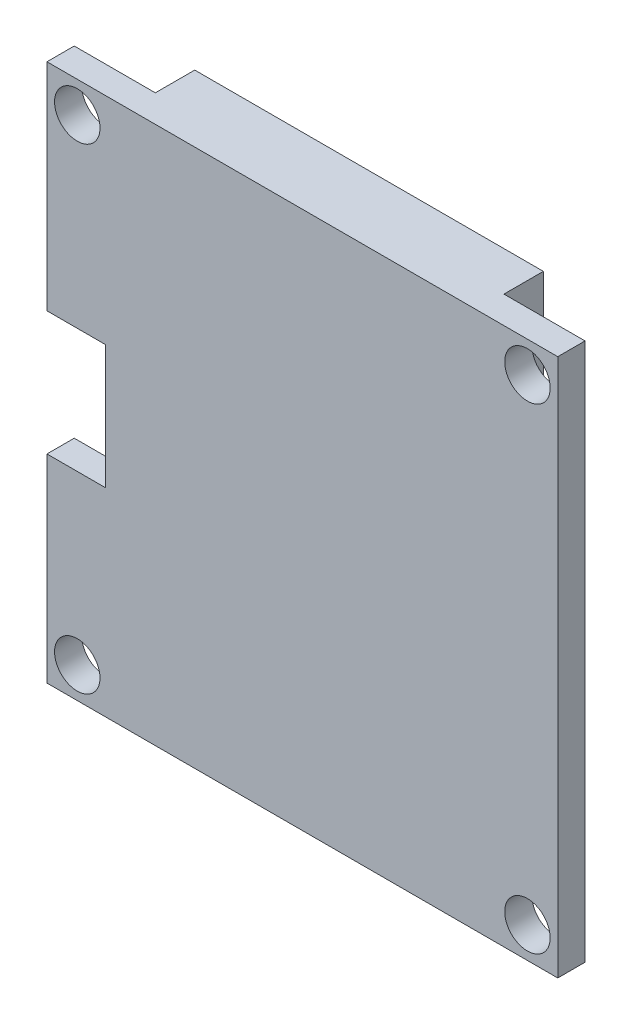
ISO-10303-21;
HEADER;
FILE_DESCRIPTION(('STEP AP214'),'2;1');
FILE_NAME('part.step','',(''),(''),'','','');
FILE_SCHEMA(('AUTOMOTIVE_DESIGN { 1 0 10303 214 1 1 1 1 }'));
ENDSEC;
DATA;
#1=APPLICATION_CONTEXT('core data for automotive mechanical design processes');
#2=APPLICATION_PROTOCOL_DEFINITION('international standard','automotive_design',2000,#1);
#3=PRODUCT_CONTEXT('',#1,'mechanical');
#4=PRODUCT('Part','Part','',(#3));
#5=PRODUCT_RELATED_PRODUCT_CATEGORY('part','',(#4));
#6=PRODUCT_DEFINITION_FORMATION('','',#4);
#7=PRODUCT_DEFINITION_CONTEXT('part definition',#1,'design');
#8=PRODUCT_DEFINITION('design','',#6,#7);
#9=PRODUCT_DEFINITION_SHAPE('','',#8);
#10=(LENGTH_UNIT() NAMED_UNIT(*) SI_UNIT(.MILLI.,.METRE.));
#11=(NAMED_UNIT(*) PLANE_ANGLE_UNIT() SI_UNIT($,.RADIAN.));
#12=(NAMED_UNIT(*) SI_UNIT($,.STERADIAN.) SOLID_ANGLE_UNIT());
#13=UNCERTAINTY_MEASURE_WITH_UNIT(LENGTH_MEASURE(1.E-05),#10,'distance_accuracy_value','');
#14=(GEOMETRIC_REPRESENTATION_CONTEXT(3) GLOBAL_UNCERTAINTY_ASSIGNED_CONTEXT((#13)) GLOBAL_UNIT_ASSIGNED_CONTEXT((#10,
#11,#12)) REPRESENTATION_CONTEXT('',''));
#15=CARTESIAN_POINT('',(0.,0.,0.));
#16=DIRECTION('',(0.,0.,1.));
#17=DIRECTION('',(1.,0.,0.));
#18=AXIS2_PLACEMENT_3D('',#15,#16,#17);
#19=CARTESIAN_POINT('',(0.,0.,0.));
#20=DIRECTION('',(0.,0.,1.));
#21=DIRECTION('',(1.,0.,0.));
#22=AXIS2_PLACEMENT_3D('',#19,#20,#21);
#23=PLANE('',#22);
#24=CARTESIAN_POINT('',(14.6772720874822,5.7173016922718,0.));
#25=DIRECTION('',(0.,0.,-1.));
#26=DIRECTION('',(-1.,0.,0.));
#27=AXIS2_PLACEMENT_3D('',#24,#25,#26);
#28=CIRCLE('',#27,0.520017215137613);
#29=CARTESIAN_POINT('',(14.1572548723445,5.7173016922718,0.));
#30=VERTEX_POINT('',#29);
#31=EDGE_CURVE('E287',#30,#30,#28,.T.);
#32=ORIENTED_EDGE('',*,*,#31,.F.);
#33=EDGE_LOOP('',(#32));
#34=FACE_BOUND('',#33,.T.);
#35=CARTESIAN_POINT('',(14.7220971332871,-5.61078136269089,0.));
#36=DIRECTION('',(0.,0.,-1.));
#37=DIRECTION('',(-1.,0.,0.));
#38=AXIS2_PLACEMENT_3D('',#35,#36,#37);
#39=CIRCLE('',#38,0.510447255882217);
#40=CARTESIAN_POINT('',(14.2116498774049,-5.61078136269089,0.));
#41=VERTEX_POINT('',#40);
#42=EDGE_CURVE('E282',#41,#41,#39,.T.);
#43=ORIENTED_EDGE('',*,*,#42,.F.);
#44=EDGE_LOOP('',(#43));
#45=FACE_BOUND('',#44,.T.);
#46=CARTESIAN_POINT('',(14.7220971332871,-1.55091435794219,0.));
#47=DIRECTION('',(0.,0.,-1.));
#48=DIRECTION('',(-1.,0.,0.));
#49=AXIS2_PLACEMENT_3D('',#46,#47,#48);
#50=CIRCLE('',#49,0.580916901952833);
#51=CARTESIAN_POINT('',(14.1411802313343,-1.55091435794219,0.));
#52=VERTEX_POINT('',#51);
#53=EDGE_CURVE('E276',#52,#52,#50,.T.);
#54=ORIENTED_EDGE('',*,*,#53,.F.);
#55=EDGE_LOOP('',(#54));
#56=FACE_BOUND('',#55,.T.);
#57=CARTESIAN_POINT('',(14.7417245462265,2.50001456672777,0.));
#58=DIRECTION('',(0.,0.,-1.));
#59=DIRECTION('',(-1.,0.,0.));
#60=AXIS2_PLACEMENT_3D('',#57,#58,#59);
#61=CIRCLE('',#60,0.52509001824319);
#62=CARTESIAN_POINT('',(14.2166345279833,2.50001456672777,0.));
#63=VERTEX_POINT('',#62);
#64=EDGE_CURVE('E269',#63,#63,#61,.T.);
#65=ORIENTED_EDGE('',*,*,#64,.F.);
#66=EDGE_LOOP('',(#65));
#67=FACE_BOUND('',#66,.T.);
#68=CARTESIAN_POINT('',(14.85,15.71,0.));
#69=DIRECTION('',(0.,0.,1.));
#70=DIRECTION('',(1.,0.,0.));
#71=AXIS2_PLACEMENT_3D('',#68,#69,#70);
#72=CIRCLE('',#71,1.5);
#73=CARTESIAN_POINT('',(16.35,15.71,0.));
#74=VERTEX_POINT('',#73);
#75=EDGE_CURVE('E214',#74,#74,#72,.F.);
#76=ORIENTED_EDGE('',*,*,#75,.F.);
#77=EDGE_LOOP('',(#76));
#78=FACE_BOUND('',#77,.T.);
#79=CARTESIAN_POINT('',(14.85,-15.71,0.));
#80=DIRECTION('',(0.,0.,1.));
#81=DIRECTION('',(1.,0.,0.));
#82=AXIS2_PLACEMENT_3D('',#79,#80,#81);
#83=CIRCLE('',#82,1.5);
#84=CARTESIAN_POINT('',(16.35,-15.71,0.));
#85=VERTEX_POINT('',#84);
#86=EDGE_CURVE('E146',#85,#85,#83,.T.);
#87=ORIENTED_EDGE('',*,*,#86,.T.);
#88=EDGE_LOOP('',(#87));
#89=FACE_BOUND('',#88,.T.);
#90=DIRECTION('',(0.,-1.,0.));
#91=VECTOR('',#90,1.);
#92=CARTESIAN_POINT('',(11.5,-17.75,0.));
#93=LINE('',#92,#91);
#94=CARTESIAN_POINT('',(11.5,17.75,0.));
#95=VERTEX_POINT('',#94);
#96=CARTESIAN_POINT('',(11.5,-17.75,0.));
#97=VERTEX_POINT('',#96);
#98=EDGE_CURVE('E145',#95,#97,#93,.T.);
#99=ORIENTED_EDGE('',*,*,#98,.F.);
#100=DIRECTION('',(-1.,0.,0.));
#101=VECTOR('',#100,1.);
#102=CARTESIAN_POINT('',(0.,17.75,0.));
#103=LINE('',#102,#101);
#104=CARTESIAN_POINT('',(16.85,17.75,0.));
#105=VERTEX_POINT('',#104);
#106=EDGE_CURVE('E192',#105,#95,#103,.T.);
#107=ORIENTED_EDGE('',*,*,#106,.F.);
#108=DIRECTION('',(0.,-1.,0.));
#109=VECTOR('',#108,1.);
#110=CARTESIAN_POINT('',(16.85,0.,0.));
#111=LINE('',#110,#109);
#112=CARTESIAN_POINT('',(16.85,-17.75,0.));
#113=VERTEX_POINT('',#112);
#114=EDGE_CURVE('E212',#105,#113,#111,.T.);
#115=ORIENTED_EDGE('',*,*,#114,.T.);
#116=DIRECTION('',(-1.,0.,0.));
#117=VECTOR('',#116,1.);
#118=CARTESIAN_POINT('',(0.,-17.75,0.));
#119=LINE('',#118,#117);
#120=EDGE_CURVE('E57',#113,#97,#119,.T.);
#121=ORIENTED_EDGE('',*,*,#120,.T.);
#122=EDGE_LOOP('',(#99,#107,#115,#121));
#123=FACE_BOUND('',#122,.T.);
#124=ADVANCED_FACE('F34',(#34,#45,#56,#67,#78,#89,#123),#23,.F.);
#125=CARTESIAN_POINT('',(-14.85,-15.71,0.));
#126=DIRECTION('',(0.,0.,1.));
#127=DIRECTION('',(1.,0.,0.));
#128=AXIS2_PLACEMENT_3D('',#125,#126,#127);
#129=CIRCLE('',#128,1.5);
#130=CARTESIAN_POINT('',(-13.35,-15.71,0.));
#131=VERTEX_POINT('',#130);
#132=EDGE_CURVE('E159',#131,#131,#129,.F.);
#133=ORIENTED_EDGE('',*,*,#132,.F.);
#134=EDGE_LOOP('',(#133));
#135=FACE_BOUND('',#134,.T.);
#136=CARTESIAN_POINT('',(-14.85,15.71,0.));
#137=DIRECTION('',(0.,0.,1.));
#138=DIRECTION('',(1.,0.,0.));
#139=AXIS2_PLACEMENT_3D('',#136,#137,#138);
#140=CIRCLE('',#139,1.49999999999999);
#141=CARTESIAN_POINT('',(-13.35,15.71,0.));
#142=VERTEX_POINT('',#141);
#143=EDGE_CURVE('E217',#142,#142,#140,.T.);
#144=ORIENTED_EDGE('',*,*,#143,.T.);
#145=EDGE_LOOP('',(#144));
#146=FACE_BOUND('',#145,.T.);
#147=DIRECTION('',(0.,1.,0.));
#148=VECTOR('',#147,1.);
#149=CARTESIAN_POINT('',(-11.5,-17.75,0.));
#150=LINE('',#149,#148);
#151=CARTESIAN_POINT('',(-11.5,-17.75,0.));
#152=VERTEX_POINT('',#151);
#153=CARTESIAN_POINT('',(-11.5,17.75,0.));
#154=VERTEX_POINT('',#153);
#155=EDGE_CURVE('E49',#152,#154,#150,.T.);
#156=ORIENTED_EDGE('',*,*,#155,.F.);
#157=CARTESIAN_POINT('',(-16.85,-17.75,0.));
#158=VERTEX_POINT('',#157);
#159=EDGE_CURVE('E210',#152,#158,#119,.T.);
#160=ORIENTED_EDGE('',*,*,#159,.T.);
#161=DIRECTION('',(0.,1.,0.));
#162=VECTOR('',#161,1.);
#163=CARTESIAN_POINT('',(-16.85,0.,0.));
#164=LINE('',#163,#162);
#165=CARTESIAN_POINT('',(-16.85,-4.65716191012433,0.));
#166=VERTEX_POINT('',#165);
#167=EDGE_CURVE('E207',#158,#166,#164,.T.);
#168=ORIENTED_EDGE('',*,*,#167,.T.);
#169=DIRECTION('',(1.,0.,0.));
#170=VECTOR('',#169,1.);
#171=CARTESIAN_POINT('',(0.,-4.65716191012433,0.));
#172=LINE('',#171,#170);
#173=CARTESIAN_POINT('',(-12.9876790580283,-4.65716191012433,0.));
#174=VERTEX_POINT('',#173);
#175=EDGE_CURVE('E204',#166,#174,#172,.T.);
#176=ORIENTED_EDGE('',*,*,#175,.T.);
#177=DIRECTION('',(0.,1.,0.));
#178=VECTOR('',#177,1.);
#179=CARTESIAN_POINT('',(-12.9876790580283,0.,0.));
#180=LINE('',#179,#178);
#181=CARTESIAN_POINT('',(-12.9876790580283,3.51907236371574,0.));
#182=VERTEX_POINT('',#181);
#183=EDGE_CURVE('E201',#174,#182,#180,.T.);
#184=ORIENTED_EDGE('',*,*,#183,.T.);
#185=DIRECTION('',(-1.,0.,0.));
#186=VECTOR('',#185,1.);
#187=CARTESIAN_POINT('',(0.,3.51907236371574,0.));
#188=LINE('',#187,#186);
#189=CARTESIAN_POINT('',(-16.85,3.51907236371574,0.));
#190=VERTEX_POINT('',#189);
#191=EDGE_CURVE('E198',#182,#190,#188,.T.);
#192=ORIENTED_EDGE('',*,*,#191,.T.);
#193=DIRECTION('',(0.,-1.,0.));
#194=VECTOR('',#193,1.);
#195=CARTESIAN_POINT('',(-16.85,0.,0.));
#196=LINE('',#195,#194);
#197=CARTESIAN_POINT('',(-16.85,17.75,0.));
#198=VERTEX_POINT('',#197);
#199=EDGE_CURVE('E195',#198,#190,#196,.T.);
#200=ORIENTED_EDGE('',*,*,#199,.F.);
#201=EDGE_CURVE('E149',#154,#198,#103,.T.);
#202=ORIENTED_EDGE('',*,*,#201,.F.);
#203=EDGE_LOOP('',(#156,#160,#168,#176,#184,#192,#200,#202));
#204=FACE_BOUND('',#203,.T.);
#205=ADVANCED_FACE('F242',(#135,#146,#204),#23,.F.);
#206=CARTESIAN_POINT('',(0.,17.75,1.8));
#207=DIRECTION('',(0.,-1.,0.));
#208=DIRECTION('',(0.,0.,-1.));
#209=AXIS2_PLACEMENT_3D('',#206,#207,#208);
#210=PLANE('',#209);
#211=ORIENTED_EDGE('',*,*,#106,.T.);
#212=DIRECTION('',(0.,0.,1.));
#213=VECTOR('',#212,1.);
#214=CARTESIAN_POINT('',(11.5,17.75,-2.6));
#215=LINE('',#214,#213);
#216=CARTESIAN_POINT('',(11.5,17.75,-2.6));
#217=VERTEX_POINT('',#216);
#218=EDGE_CURVE('E266',#217,#95,#215,.T.);
#219=ORIENTED_EDGE('',*,*,#218,.F.);
#220=DIRECTION('',(1.,0.,0.));
#221=VECTOR('',#220,1.);
#222=CARTESIAN_POINT('',(-11.5,17.75,-2.6));
#223=LINE('',#222,#221);
#224=CARTESIAN_POINT('',(-11.5,17.75,-2.6));
#225=VERTEX_POINT('',#224);
#226=EDGE_CURVE('E139',#225,#217,#223,.T.);
#227=ORIENTED_EDGE('',*,*,#226,.F.);
#228=DIRECTION('',(0.,0.,1.));
#229=VECTOR('',#228,1.);
#230=CARTESIAN_POINT('',(-11.5,17.75,-2.6));
#231=LINE('',#230,#229);
#232=EDGE_CURVE('E151',#225,#154,#231,.T.);
#233=ORIENTED_EDGE('',*,*,#232,.T.);
#234=ORIENTED_EDGE('',*,*,#201,.T.);
#235=DIRECTION('',(0.,0.,-1.));
#236=VECTOR('',#235,1.);
#237=CARTESIAN_POINT('',(-16.85,17.75,1.8));
#238=LINE('',#237,#236);
#239=CARTESIAN_POINT('',(-16.85,17.75,1.8));
#240=VERTEX_POINT('',#239);
#241=EDGE_CURVE('E11',#240,#198,#238,.T.);
#242=ORIENTED_EDGE('',*,*,#241,.F.);
#243=DIRECTION('',(-1.,0.,0.));
#244=VECTOR('',#243,1.);
#245=CARTESIAN_POINT('',(0.,17.75,1.8));
#246=LINE('',#245,#244);
#247=CARTESIAN_POINT('',(16.85,17.75,1.8));
#248=VERTEX_POINT('',#247);
#249=EDGE_CURVE('E158',#248,#240,#246,.T.);
#250=ORIENTED_EDGE('',*,*,#249,.F.);
#251=DIRECTION('',(0.,0.,-1.));
#252=VECTOR('',#251,1.);
#253=CARTESIAN_POINT('',(16.85,17.75,1.8));
#254=LINE('',#253,#252);
#255=EDGE_CURVE('E190',#248,#105,#254,.T.);
#256=ORIENTED_EDGE('',*,*,#255,.T.);
#257=EDGE_LOOP('',(#211,#219,#227,#233,#234,#242,#250,#256));
#258=FACE_BOUND('',#257,.T.);
#259=ADVANCED_FACE('F256',(#258),#210,.F.);
#260=CARTESIAN_POINT('',(-16.85,0.,1.8));
#261=DIRECTION('',(1.,0.,0.));
#262=DIRECTION('',(0.,0.,-1.));
#263=AXIS2_PLACEMENT_3D('',#260,#261,#262);
#264=PLANE('',#263);
#265=ORIENTED_EDGE('',*,*,#199,.T.);
#266=DIRECTION('',(0.,0.,-1.));
#267=VECTOR('',#266,1.);
#268=CARTESIAN_POINT('',(-16.85,3.51907236371574,1.8));
#269=LINE('',#268,#267);
#270=CARTESIAN_POINT('',(-16.85,3.51907236371574,1.8));
#271=VERTEX_POINT('',#270);
#272=EDGE_CURVE('E42',#271,#190,#269,.T.);
#273=ORIENTED_EDGE('',*,*,#272,.F.);
#274=DIRECTION('',(0.,-1.,0.));
#275=VECTOR('',#274,1.);
#276=CARTESIAN_POINT('',(-16.85,0.,1.8));
#277=LINE('',#276,#275);
#278=EDGE_CURVE('E162',#240,#271,#277,.T.);
#279=ORIENTED_EDGE('',*,*,#278,.F.);
#280=ORIENTED_EDGE('',*,*,#241,.T.);
#281=EDGE_LOOP('',(#265,#273,#279,#280));
#282=FACE_BOUND('',#281,.T.);
#283=ADVANCED_FACE('F240',(#282),#264,.F.);
#284=CARTESIAN_POINT('',(0.,3.51907236371574,1.8));
#285=DIRECTION('',(0.,-1.,0.));
#286=DIRECTION('',(0.,0.,-1.));
#287=AXIS2_PLACEMENT_3D('',#284,#285,#286);
#288=PLANE('',#287);
#289=ORIENTED_EDGE('',*,*,#191,.F.);
#290=DIRECTION('',(0.,0.,-1.));
#291=VECTOR('',#290,1.);
#292=CARTESIAN_POINT('',(-12.9876790580283,3.51907236371574,1.8));
#293=LINE('',#292,#291);
#294=CARTESIAN_POINT('',(-12.9876790580283,3.51907236371574,1.8));
#295=VERTEX_POINT('',#294);
#296=EDGE_CURVE('E232',#295,#182,#293,.T.);
#297=ORIENTED_EDGE('',*,*,#296,.F.);
#298=DIRECTION('',(-1.,0.,0.));
#299=VECTOR('',#298,1.);
#300=CARTESIAN_POINT('',(0.,3.51907236371574,1.8));
#301=LINE('',#300,#299);
#302=EDGE_CURVE('E164',#295,#271,#301,.T.);
#303=ORIENTED_EDGE('',*,*,#302,.T.);
#304=ORIENTED_EDGE('',*,*,#272,.T.);
#305=EDGE_LOOP('',(#289,#297,#303,#304));
#306=FACE_BOUND('',#305,.T.);
#307=ADVANCED_FACE('F236',(#306),#288,.T.);
#308=CARTESIAN_POINT('',(-12.9876790580283,0.,1.8));
#309=DIRECTION('',(-1.,0.,0.));
#310=DIRECTION('',(0.,0.,1.));
#311=AXIS2_PLACEMENT_3D('',#308,#309,#310);
#312=PLANE('',#311);
#313=ORIENTED_EDGE('',*,*,#183,.F.);
#314=DIRECTION('',(0.,0.,-1.));
#315=VECTOR('',#314,1.);
#316=CARTESIAN_POINT('',(-12.9876790580283,-4.65716191012433,1.8));
#317=LINE('',#316,#315);
#318=CARTESIAN_POINT('',(-12.9876790580283,-4.65716191012433,1.8));
#319=VERTEX_POINT('',#318);
#320=EDGE_CURVE('E230',#319,#174,#317,.T.);
#321=ORIENTED_EDGE('',*,*,#320,.F.);
#322=DIRECTION('',(0.,1.,0.));
#323=VECTOR('',#322,1.);
#324=CARTESIAN_POINT('',(-12.9876790580283,0.,1.8));
#325=LINE('',#324,#323);
#326=EDGE_CURVE('E167',#319,#295,#325,.T.);
#327=ORIENTED_EDGE('',*,*,#326,.T.);
#328=ORIENTED_EDGE('',*,*,#296,.T.);
#329=EDGE_LOOP('',(#313,#321,#327,#328));
#330=FACE_BOUND('',#329,.T.);
#331=ADVANCED_FACE('F246',(#330),#312,.T.);
#332=CARTESIAN_POINT('',(0.,-4.65716191012433,1.8));
#333=DIRECTION('',(0.,1.,0.));
#334=DIRECTION('',(0.,0.,1.));
#335=AXIS2_PLACEMENT_3D('',#332,#333,#334);
#336=PLANE('',#335);
#337=ORIENTED_EDGE('',*,*,#175,.F.);
#338=DIRECTION('',(0.,0.,-1.));
#339=VECTOR('',#338,1.);
#340=CARTESIAN_POINT('',(-16.85,-4.65716191012433,1.8));
#341=LINE('',#340,#339);
#342=CARTESIAN_POINT('',(-16.85,-4.65716191012433,1.8));
#343=VERTEX_POINT('',#342);
#344=EDGE_CURVE('E228',#343,#166,#341,.T.);
#345=ORIENTED_EDGE('',*,*,#344,.F.);
#346=DIRECTION('',(1.,0.,0.));
#347=VECTOR('',#346,1.);
#348=CARTESIAN_POINT('',(0.,-4.65716191012433,1.8));
#349=LINE('',#348,#347);
#350=EDGE_CURVE('E170',#343,#319,#349,.T.);
#351=ORIENTED_EDGE('',*,*,#350,.T.);
#352=ORIENTED_EDGE('',*,*,#320,.T.);
#353=EDGE_LOOP('',(#337,#345,#351,#352));
#354=FACE_BOUND('',#353,.T.);
#355=ADVANCED_FACE('F323',(#354),#336,.T.);
#356=CARTESIAN_POINT('',(-16.85,0.,1.8));
#357=DIRECTION('',(-1.,0.,0.));
#358=DIRECTION('',(0.,0.,1.));
#359=AXIS2_PLACEMENT_3D('',#356,#357,#358);
#360=PLANE('',#359);
#361=ORIENTED_EDGE('',*,*,#167,.F.);
#362=DIRECTION('',(0.,0.,-1.));
#363=VECTOR('',#362,1.);
#364=CARTESIAN_POINT('',(-16.85,-17.75,1.8));
#365=LINE('',#364,#363);
#366=CARTESIAN_POINT('',(-16.85,-17.75,1.8));
#367=VERTEX_POINT('',#366);
#368=EDGE_CURVE('E225',#367,#158,#365,.T.);
#369=ORIENTED_EDGE('',*,*,#368,.F.);
#370=DIRECTION('',(0.,1.,0.));
#371=VECTOR('',#370,1.);
#372=CARTESIAN_POINT('',(-16.85,0.,1.8));
#373=LINE('',#372,#371);
#374=EDGE_CURVE('E173',#367,#343,#373,.T.);
#375=ORIENTED_EDGE('',*,*,#374,.T.);
#376=ORIENTED_EDGE('',*,*,#344,.T.);
#377=EDGE_LOOP('',(#361,#369,#375,#376));
#378=FACE_BOUND('',#377,.T.);
#379=ADVANCED_FACE('F321',(#378),#360,.T.);
#380=CARTESIAN_POINT('',(0.,-17.75,1.8));
#381=DIRECTION('',(0.,-1.,0.));
#382=DIRECTION('',(0.,0.,-1.));
#383=AXIS2_PLACEMENT_3D('',#380,#381,#382);
#384=PLANE('',#383);
#385=ORIENTED_EDGE('',*,*,#120,.F.);
#386=DIRECTION('',(0.,0.,-1.));
#387=VECTOR('',#386,1.);
#388=CARTESIAN_POINT('',(16.85,-17.75,1.8));
#389=LINE('',#388,#387);
#390=CARTESIAN_POINT('',(16.85,-17.75,1.8));
#391=VERTEX_POINT('',#390);
#392=EDGE_CURVE('E223',#391,#113,#389,.T.);
#393=ORIENTED_EDGE('',*,*,#392,.F.);
#394=DIRECTION('',(-1.,0.,0.));
#395=VECTOR('',#394,1.);
#396=CARTESIAN_POINT('',(0.,-17.75,1.8));
#397=LINE('',#396,#395);
#398=EDGE_CURVE('E176',#391,#367,#397,.T.);
#399=ORIENTED_EDGE('',*,*,#398,.T.);
#400=ORIENTED_EDGE('',*,*,#368,.T.);
#401=ORIENTED_EDGE('',*,*,#159,.F.);
#402=DIRECTION('',(0.,0.,1.));
#403=VECTOR('',#402,1.);
#404=CARTESIAN_POINT('',(-11.5,-17.75,-2.6));
#405=LINE('',#404,#403);
#406=CARTESIAN_POINT('',(-11.5,-17.75,-2.6));
#407=VERTEX_POINT('',#406);
#408=EDGE_CURVE('E130',#407,#152,#405,.T.);
#409=ORIENTED_EDGE('',*,*,#408,.F.);
#410=DIRECTION('',(-1.,0.,0.));
#411=VECTOR('',#410,1.);
#412=CARTESIAN_POINT('',(-11.5,-17.75,-2.6));
#413=LINE('',#412,#411);
#414=CARTESIAN_POINT('',(11.5,-17.75,-2.6));
#415=VERTEX_POINT('',#414);
#416=EDGE_CURVE('E123',#415,#407,#413,.T.);
#417=ORIENTED_EDGE('',*,*,#416,.F.);
#418=DIRECTION('',(0.,0.,1.));
#419=VECTOR('',#418,1.);
#420=CARTESIAN_POINT('',(11.5,-17.75,-2.6));
#421=LINE('',#420,#419);
#422=EDGE_CURVE('E127',#415,#97,#421,.T.);
#423=ORIENTED_EDGE('',*,*,#422,.T.);
#424=EDGE_LOOP('',(#385,#393,#399,#400,#401,#409,#417,#423));
#425=FACE_BOUND('',#424,.T.);
#426=ADVANCED_FACE('F125',(#425),#384,.T.);
#427=CARTESIAN_POINT('',(-14.85,15.71,1.8));
#428=DIRECTION('',(0.,0.,-1.));
#429=DIRECTION('',(-1.,0.,0.));
#430=AXIS2_PLACEMENT_3D('',#427,#428,#429);
#431=CYLINDRICAL_SURFACE('',#430,1.49999999999999);
#432=CARTESIAN_POINT('',(-14.85,15.71,1.8));
#433=DIRECTION('',(0.,0.,1.));
#434=DIRECTION('',(1.,0.,0.));
#435=AXIS2_PLACEMENT_3D('',#432,#433,#434);
#436=CIRCLE('',#435,1.49999999999999);
#437=CARTESIAN_POINT('',(-13.35,15.71,1.8));
#438=VERTEX_POINT('',#437);
#439=EDGE_CURVE('E185',#438,#438,#436,.T.);
#440=ORIENTED_EDGE('',*,*,#439,.T.);
#441=EDGE_LOOP('',(#440));
#442=FACE_BOUND('',#441,.T.);
#443=ORIENTED_EDGE('',*,*,#143,.F.);
#444=EDGE_LOOP('',(#443));
#445=FACE_BOUND('',#444,.T.);
#446=ADVANCED_FACE('F353',(#442,#445),#431,.F.);
#447=CARTESIAN_POINT('',(14.85,15.71,1.8));
#448=DIRECTION('',(0.,0.,-1.));
#449=DIRECTION('',(-1.,0.,0.));
#450=AXIS2_PLACEMENT_3D('',#447,#448,#449);
#451=CYLINDRICAL_SURFACE('',#450,1.5);
#452=CARTESIAN_POINT('',(14.85,15.71,1.8));
#453=DIRECTION('',(0.,0.,1.));
#454=DIRECTION('',(1.,0.,0.));
#455=AXIS2_PLACEMENT_3D('',#452,#453,#454);
#456=CIRCLE('',#455,1.5);
#457=CARTESIAN_POINT('',(16.35,15.71,1.8));
#458=VERTEX_POINT('',#457);
#459=EDGE_CURVE('E182',#458,#458,#456,.F.);
#460=ORIENTED_EDGE('',*,*,#459,.F.);
#461=EDGE_LOOP('',(#460));
#462=FACE_BOUND('',#461,.T.);
#463=ORIENTED_EDGE('',*,*,#75,.T.);
#464=EDGE_LOOP('',(#463));
#465=FACE_BOUND('',#464,.T.);
#466=ADVANCED_FACE('F356',(#462,#465),#451,.F.);
#467=CARTESIAN_POINT('',(16.85,0.,1.8));
#468=DIRECTION('',(1.,0.,0.));
#469=DIRECTION('',(0.,1.,0.));
#470=AXIS2_PLACEMENT_3D('',#467,#468,#469);
#471=PLANE('',#470);
#472=ORIENTED_EDGE('',*,*,#114,.F.);
#473=ORIENTED_EDGE('',*,*,#255,.F.);
#474=DIRECTION('',(0.,-1.,0.));
#475=VECTOR('',#474,1.);
#476=CARTESIAN_POINT('',(16.85,0.,1.8));
#477=LINE('',#476,#475);
#478=EDGE_CURVE('E179',#248,#391,#477,.T.);
#479=ORIENTED_EDGE('',*,*,#478,.T.);
#480=ORIENTED_EDGE('',*,*,#392,.T.);
#481=EDGE_LOOP('',(#472,#473,#479,#480));
#482=FACE_BOUND('',#481,.T.);
#483=ADVANCED_FACE('F317',(#482),#471,.T.);
#484=CARTESIAN_POINT('',(14.85,-15.71,1.8));
#485=DIRECTION('',(0.,0.,-1.));
#486=DIRECTION('',(-1.,0.,0.));
#487=AXIS2_PLACEMENT_3D('',#484,#485,#486);
#488=CYLINDRICAL_SURFACE('',#487,1.5);
#489=CARTESIAN_POINT('',(14.85,-15.71,1.8));
#490=DIRECTION('',(0.,0.,1.));
#491=DIRECTION('',(1.,0.,0.));
#492=AXIS2_PLACEMENT_3D('',#489,#490,#491);
#493=CIRCLE('',#492,1.5);
#494=CARTESIAN_POINT('',(16.35,-15.71,1.8));
#495=VERTEX_POINT('',#494);
#496=EDGE_CURVE('E155',#495,#495,#493,.T.);
#497=ORIENTED_EDGE('',*,*,#496,.T.);
#498=EDGE_LOOP('',(#497));
#499=FACE_BOUND('',#498,.T.);
#500=ORIENTED_EDGE('',*,*,#86,.F.);
#501=EDGE_LOOP('',(#500));
#502=FACE_BOUND('',#501,.T.);
#503=ADVANCED_FACE('F36',(#499,#502),#488,.F.);
#504=CARTESIAN_POINT('',(-14.85,-15.71,1.8));
#505=DIRECTION('',(0.,0.,-1.));
#506=DIRECTION('',(-1.,0.,0.));
#507=AXIS2_PLACEMENT_3D('',#504,#505,#506);
#508=CYLINDRICAL_SURFACE('',#507,1.5);
#509=CARTESIAN_POINT('',(-14.85,-15.71,1.8));
#510=DIRECTION('',(0.,0.,1.));
#511=DIRECTION('',(1.,0.,0.));
#512=AXIS2_PLACEMENT_3D('',#509,#510,#511);
#513=CIRCLE('',#512,1.5);
#514=CARTESIAN_POINT('',(-13.35,-15.71,1.8));
#515=VERTEX_POINT('',#514);
#516=EDGE_CURVE('E188',#515,#515,#513,.F.);
#517=ORIENTED_EDGE('',*,*,#516,.F.);
#518=EDGE_LOOP('',(#517));
#519=FACE_BOUND('',#518,.T.);
#520=ORIENTED_EDGE('',*,*,#132,.T.);
#521=EDGE_LOOP('',(#520));
#522=FACE_BOUND('',#521,.T.);
#523=ADVANCED_FACE('F349',(#519,#522),#508,.F.);
#524=CARTESIAN_POINT('',(0.,0.,1.8));
#525=DIRECTION('',(0.,0.,1.));
#526=DIRECTION('',(1.,0.,0.));
#527=AXIS2_PLACEMENT_3D('',#524,#525,#526);
#528=PLANE('',#527);
#529=ORIENTED_EDGE('',*,*,#496,.F.);
#530=EDGE_LOOP('',(#529));
#531=FACE_BOUND('',#530,.T.);
#532=ORIENTED_EDGE('',*,*,#249,.T.);
#533=ORIENTED_EDGE('',*,*,#278,.T.);
#534=ORIENTED_EDGE('',*,*,#302,.F.);
#535=ORIENTED_EDGE('',*,*,#326,.F.);
#536=ORIENTED_EDGE('',*,*,#350,.F.);
#537=ORIENTED_EDGE('',*,*,#374,.F.);
#538=ORIENTED_EDGE('',*,*,#398,.F.);
#539=ORIENTED_EDGE('',*,*,#478,.F.);
#540=EDGE_LOOP('',(#532,#533,#534,#535,#536,#537,#538,#539));
#541=FACE_BOUND('',#540,.T.);
#542=ORIENTED_EDGE('',*,*,#459,.T.);
#543=EDGE_LOOP('',(#542));
#544=FACE_BOUND('',#543,.T.);
#545=ORIENTED_EDGE('',*,*,#439,.F.);
#546=EDGE_LOOP('',(#545));
#547=FACE_BOUND('',#546,.T.);
#548=ORIENTED_EDGE('',*,*,#516,.T.);
#549=EDGE_LOOP('',(#548));
#550=FACE_BOUND('',#549,.T.);
#551=ADVANCED_FACE('F249',(#531,#541,#544,#547,#550),#528,.T.);
#552=CARTESIAN_POINT('',(11.5,-17.75,-2.6));
#553=DIRECTION('',(-1.,0.,0.));
#554=DIRECTION('',(0.,0.,1.));
#555=AXIS2_PLACEMENT_3D('',#552,#553,#554);
#556=PLANE('',#555);
#557=ORIENTED_EDGE('',*,*,#98,.T.);
#558=ORIENTED_EDGE('',*,*,#422,.F.);
#559=DIRECTION('',(0.,-1.,0.));
#560=VECTOR('',#559,1.);
#561=CARTESIAN_POINT('',(11.5,-17.75,-2.6));
#562=LINE('',#561,#560);
#563=EDGE_CURVE('E134',#217,#415,#562,.T.);
#564=ORIENTED_EDGE('',*,*,#563,.F.);
#565=ORIENTED_EDGE('',*,*,#218,.T.);
#566=EDGE_LOOP('',(#557,#558,#564,#565));
#567=FACE_BOUND('',#566,.T.);
#568=ADVANCED_FACE('F144',(#567),#556,.F.);
#569=CARTESIAN_POINT('',(-11.5,-17.75,-2.6));
#570=DIRECTION('',(1.,0.,0.));
#571=DIRECTION('',(0.,0.,-1.));
#572=AXIS2_PLACEMENT_3D('',#569,#570,#571);
#573=PLANE('',#572);
#574=ORIENTED_EDGE('',*,*,#155,.T.);
#575=ORIENTED_EDGE('',*,*,#232,.F.);
#576=DIRECTION('',(0.,1.,0.));
#577=VECTOR('',#576,1.);
#578=CARTESIAN_POINT('',(-11.5,-17.75,-2.6));
#579=LINE('',#578,#577);
#580=EDGE_CURVE('E133',#407,#225,#579,.T.);
#581=ORIENTED_EDGE('',*,*,#580,.F.);
#582=ORIENTED_EDGE('',*,*,#408,.T.);
#583=EDGE_LOOP('',(#574,#575,#581,#582));
#584=FACE_BOUND('',#583,.T.);
#585=ADVANCED_FACE('F260',(#584),#573,.F.);
#586=CARTESIAN_POINT('',(0.,0.,-2.6));
#587=DIRECTION('',(0.,0.,-1.));
#588=DIRECTION('',(-1.,0.,0.));
#589=AXIS2_PLACEMENT_3D('',#586,#587,#588);
#590=PLANE('',#589);
#591=ORIENTED_EDGE('',*,*,#563,.T.);
#592=ORIENTED_EDGE('',*,*,#416,.T.);
#593=ORIENTED_EDGE('',*,*,#580,.T.);
#594=ORIENTED_EDGE('',*,*,#226,.T.);
#595=EDGE_LOOP('',(#591,#592,#593,#594));
#596=FACE_BOUND('',#595,.T.);
#597=ADVANCED_FACE('F137',(#596),#590,.T.);
#598=CARTESIAN_POINT('',(14.7417245462265,2.50001456672777,1.));
#599=DIRECTION('',(0.,0.,-1.));
#600=DIRECTION('',(-1.,0.,0.));
#601=AXIS2_PLACEMENT_3D('',#598,#599,#600);
#602=CYLINDRICAL_SURFACE('',#601,0.52509001824319);
#603=CARTESIAN_POINT('',(14.7417245462265,2.50001456672777,1.));
#604=DIRECTION('',(0.,0.,-1.));
#605=DIRECTION('',(-1.,0.,0.));
#606=AXIS2_PLACEMENT_3D('',#603,#604,#605);
#607=CIRCLE('',#606,0.52509001824319);
#608=CARTESIAN_POINT('',(14.2166345279833,2.50001456672777,1.));
#609=VERTEX_POINT('',#608);
#610=EDGE_CURVE('E272',#609,#609,#607,.T.);
#611=ORIENTED_EDGE('',*,*,#610,.F.);
#612=EDGE_LOOP('',(#611));
#613=FACE_BOUND('',#612,.T.);
#614=ORIENTED_EDGE('',*,*,#64,.T.);
#615=EDGE_LOOP('',(#614));
#616=FACE_BOUND('',#615,.T.);
#617=ADVANCED_FACE('F414',(#613,#616),#602,.F.);
#618=CARTESIAN_POINT('',(14.7417245462265,2.50001456672777,1.));
#619=DIRECTION('',(0.,0.,-1.));
#620=DIRECTION('',(-1.,0.,0.));
#621=AXIS2_PLACEMENT_3D('',#618,#619,#620);
#622=PLANE('',#621);
#623=ORIENTED_EDGE('',*,*,#610,.T.);
#624=EDGE_LOOP('',(#623));
#625=FACE_BOUND('',#624,.T.);
#626=ADVANCED_FACE('F422',(#625),#622,.T.);
#627=CARTESIAN_POINT('',(14.7220971332871,-1.55091435794219,1.));
#628=DIRECTION('',(0.,0.,-1.));
#629=DIRECTION('',(-1.,0.,0.));
#630=AXIS2_PLACEMENT_3D('',#627,#628,#629);
#631=CYLINDRICAL_SURFACE('',#630,0.580916901952833);
#632=CARTESIAN_POINT('',(14.7220971332871,-1.55091435794219,1.));
#633=DIRECTION('',(0.,0.,-1.));
#634=DIRECTION('',(-1.,0.,0.));
#635=AXIS2_PLACEMENT_3D('',#632,#633,#634);
#636=CIRCLE('',#635,0.580916901952833);
#637=CARTESIAN_POINT('',(14.1411802313343,-1.55091435794219,1.));
#638=VERTEX_POINT('',#637);
#639=EDGE_CURVE('E279',#638,#638,#636,.T.);
#640=ORIENTED_EDGE('',*,*,#639,.F.);
#641=EDGE_LOOP('',(#640));
#642=FACE_BOUND('',#641,.T.);
#643=ORIENTED_EDGE('',*,*,#53,.T.);
#644=EDGE_LOOP('',(#643));
#645=FACE_BOUND('',#644,.T.);
#646=ADVANCED_FACE('F431',(#642,#645),#631,.F.);
#647=CARTESIAN_POINT('',(14.7220971332871,-1.55091435794219,1.));
#648=DIRECTION('',(0.,0.,-1.));
#649=DIRECTION('',(-1.,0.,0.));
#650=AXIS2_PLACEMENT_3D('',#647,#648,#649);
#651=PLANE('',#650);
#652=ORIENTED_EDGE('',*,*,#639,.T.);
#653=EDGE_LOOP('',(#652));
#654=FACE_BOUND('',#653,.T.);
#655=ADVANCED_FACE('F439',(#654),#651,.T.);
#656=CARTESIAN_POINT('',(14.7220971332871,-5.61078136269089,1.));
#657=DIRECTION('',(0.,0.,-1.));
#658=DIRECTION('',(-1.,0.,0.));
#659=AXIS2_PLACEMENT_3D('',#656,#657,#658);
#660=CYLINDRICAL_SURFACE('',#659,0.510447255882217);
#661=CARTESIAN_POINT('',(14.7220971332871,-5.61078136269089,1.));
#662=DIRECTION('',(0.,0.,-1.));
#663=DIRECTION('',(-1.,0.,0.));
#664=AXIS2_PLACEMENT_3D('',#661,#662,#663);
#665=CIRCLE('',#664,0.510447255882217);
#666=CARTESIAN_POINT('',(14.2116498774049,-5.61078136269089,1.));
#667=VERTEX_POINT('',#666);
#668=EDGE_CURVE('E262',#667,#667,#665,.T.);
#669=ORIENTED_EDGE('',*,*,#668,.F.);
#670=EDGE_LOOP('',(#669));
#671=FACE_BOUND('',#670,.T.);
#672=ORIENTED_EDGE('',*,*,#42,.T.);
#673=EDGE_LOOP('',(#672));
#674=FACE_BOUND('',#673,.T.);
#675=ADVANCED_FACE('F447',(#671,#674),#660,.F.);
#676=CARTESIAN_POINT('',(14.7220971332871,-5.61078136269089,1.));
#677=DIRECTION('',(0.,0.,-1.));
#678=DIRECTION('',(-1.,0.,0.));
#679=AXIS2_PLACEMENT_3D('',#676,#677,#678);
#680=PLANE('',#679);
#681=ORIENTED_EDGE('',*,*,#668,.T.);
#682=EDGE_LOOP('',(#681));
#683=FACE_BOUND('',#682,.T.);
#684=ADVANCED_FACE('F298',(#683),#680,.T.);
#685=CARTESIAN_POINT('',(14.6772720874822,5.7173016922718,1.));
#686=DIRECTION('',(0.,0.,-1.));
#687=DIRECTION('',(-1.,0.,0.));
#688=AXIS2_PLACEMENT_3D('',#685,#686,#687);
#689=CYLINDRICAL_SURFACE('',#688,0.520017215137613);
#690=CARTESIAN_POINT('',(14.6772720874822,5.7173016922718,1.));
#691=DIRECTION('',(0.,0.,-1.));
#692=DIRECTION('',(-1.,0.,0.));
#693=AXIS2_PLACEMENT_3D('',#690,#691,#692);
#694=CIRCLE('',#693,0.520017215137613);
#695=CARTESIAN_POINT('',(14.1572548723445,5.7173016922718,1.));
#696=VERTEX_POINT('',#695);
#697=EDGE_CURVE('E273',#696,#696,#694,.T.);
#698=ORIENTED_EDGE('',*,*,#697,.F.);
#699=EDGE_LOOP('',(#698));
#700=FACE_BOUND('',#699,.T.);
#701=ORIENTED_EDGE('',*,*,#31,.T.);
#702=EDGE_LOOP('',(#701));
#703=FACE_BOUND('',#702,.T.);
#704=ADVANCED_FACE('F295',(#700,#703),#689,.F.);
#705=CARTESIAN_POINT('',(14.6772720874822,5.7173016922718,1.));
#706=DIRECTION('',(0.,0.,-1.));
#707=DIRECTION('',(-1.,0.,0.));
#708=AXIS2_PLACEMENT_3D('',#705,#706,#707);
#709=PLANE('',#708);
#710=ORIENTED_EDGE('',*,*,#697,.T.);
#711=EDGE_LOOP('',(#710));
#712=FACE_BOUND('',#711,.T.);
#713=ADVANCED_FACE('F293',(#712),#709,.T.);
#714=CLOSED_SHELL('',(#124,#205,#259,#283,#307,#331,#355,#379,#426,#446,#466,#483,#503,#523,
#551,#568,#585,#597,#617,#626,#646,#655,#675,#684,#704,#713));
#715=MANIFOLD_SOLID_BREP('B2',#714);
#716=ADVANCED_BREP_SHAPE_REPRESENTATION('',(#18,#715),#14);
#717=SHAPE_DEFINITION_REPRESENTATION(#9,#716);
ENDSEC;
END-ISO-10303-21;
